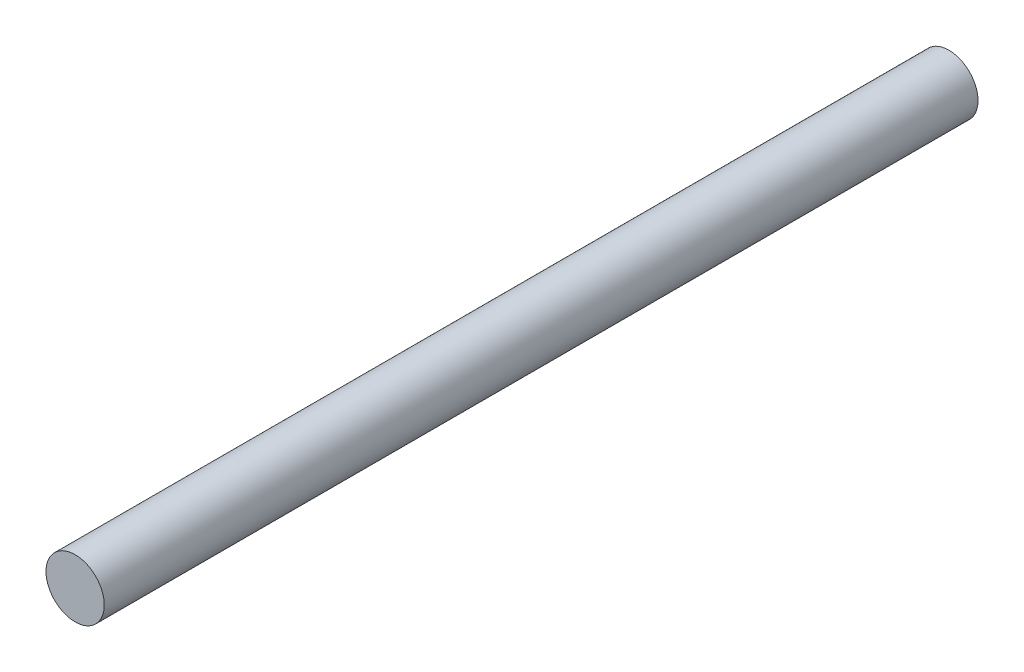
ISO-10303-21;
HEADER;
FILE_DESCRIPTION(('STEP AP214'),'2;1');
FILE_NAME('part.step','',(''),(''),'','','');
FILE_SCHEMA(('AUTOMOTIVE_DESIGN { 1 0 10303 214 1 1 1 1 }'));
ENDSEC;
DATA;
#1=APPLICATION_CONTEXT('core data for automotive mechanical design processes');
#2=APPLICATION_PROTOCOL_DEFINITION('international standard','automotive_design',2000,#1);
#3=PRODUCT_CONTEXT('',#1,'mechanical');
#4=PRODUCT('Part','Part','',(#3));
#5=PRODUCT_RELATED_PRODUCT_CATEGORY('part','',(#4));
#6=PRODUCT_DEFINITION_FORMATION('','',#4);
#7=PRODUCT_DEFINITION_CONTEXT('part definition',#1,'design');
#8=PRODUCT_DEFINITION('design','',#6,#7);
#9=PRODUCT_DEFINITION_SHAPE('','',#8);
#10=(LENGTH_UNIT() NAMED_UNIT(*) SI_UNIT(.MILLI.,.METRE.));
#11=(NAMED_UNIT(*) PLANE_ANGLE_UNIT() SI_UNIT($,.RADIAN.));
#12=(NAMED_UNIT(*) SI_UNIT($,.STERADIAN.) SOLID_ANGLE_UNIT());
#13=UNCERTAINTY_MEASURE_WITH_UNIT(LENGTH_MEASURE(1.E-05),#10,'distance_accuracy_value','');
#14=(GEOMETRIC_REPRESENTATION_CONTEXT(3) GLOBAL_UNCERTAINTY_ASSIGNED_CONTEXT((#13)) GLOBAL_UNIT_ASSIGNED_CONTEXT((#10,
#11,#12)) REPRESENTATION_CONTEXT('',''));
#15=CARTESIAN_POINT('',(0.,0.,0.));
#16=DIRECTION('',(0.,0.,1.));
#17=DIRECTION('',(1.,0.,0.));
#18=AXIS2_PLACEMENT_3D('',#15,#16,#17);
#19=CARTESIAN_POINT('',(0.,0.,180.));
#20=DIRECTION('',(0.,0.,-1.));
#21=DIRECTION('',(-1.,0.,0.));
#22=AXIS2_PLACEMENT_3D('',#19,#20,#21);
#23=CYLINDRICAL_SURFACE('',#22,6.);
#24=CARTESIAN_POINT('',(0.,0.,180.));
#25=DIRECTION('',(0.,0.,1.));
#26=DIRECTION('',(1.,0.,0.));
#27=AXIS2_PLACEMENT_3D('',#24,#25,#26);
#28=CIRCLE('',#27,6.);
#29=CARTESIAN_POINT('',(-6.,0.,180.));
#30=VERTEX_POINT('',#29);
#31=EDGE_CURVE('E10',#30,#30,#28,.T.);
#32=CARTESIAN_POINT('',(0.,0.,0.));
#33=DIRECTION('',(0.,0.,1.));
#34=DIRECTION('',(1.,0.,0.));
#35=AXIS2_PLACEMENT_3D('',#32,#33,#34);
#36=CIRCLE('',#35,6.);
#37=CARTESIAN_POINT('',(-6.,0.,0.));
#38=VERTEX_POINT('',#37);
#39=EDGE_CURVE('E34',#38,#38,#36,.T.);
#40=CARTESIAN_POINT('',(-6.,0.,180.));
#41=CARTESIAN_POINT('',(-6.,0.,178.125));
#42=CARTESIAN_POINT('',(-6.,0.,176.25));
#43=CARTESIAN_POINT('',(-6.,0.,172.5));
#44=CARTESIAN_POINT('',(-6.,0.,170.625));
#45=CARTESIAN_POINT('',(-6.,0.,166.875));
#46=CARTESIAN_POINT('',(-6.,0.,165.));
#47=CARTESIAN_POINT('',(-6.,0.,161.25));
#48=CARTESIAN_POINT('',(-6.,0.,159.375));
#49=CARTESIAN_POINT('',(-6.,0.,155.625));
#50=CARTESIAN_POINT('',(-6.,0.,153.75));
#51=CARTESIAN_POINT('',(-6.,0.,150.));
#52=CARTESIAN_POINT('',(-6.,0.,148.125));
#53=CARTESIAN_POINT('',(-6.,0.,144.375));
#54=CARTESIAN_POINT('',(-6.,0.,142.5));
#55=CARTESIAN_POINT('',(-6.,0.,138.75));
#56=CARTESIAN_POINT('',(-6.,0.,136.875));
#57=CARTESIAN_POINT('',(-6.,0.,133.125));
#58=CARTESIAN_POINT('',(-6.,0.,131.25));
#59=CARTESIAN_POINT('',(-6.,0.,127.5));
#60=CARTESIAN_POINT('',(-6.,0.,125.625));
#61=CARTESIAN_POINT('',(-6.,0.,121.875));
#62=CARTESIAN_POINT('',(-6.,0.,120.));
#63=CARTESIAN_POINT('',(-6.,0.,116.25));
#64=CARTESIAN_POINT('',(-6.,0.,114.375));
#65=CARTESIAN_POINT('',(-6.,0.,110.625));
#66=CARTESIAN_POINT('',(-6.,0.,108.75));
#67=CARTESIAN_POINT('',(-6.,0.,105.));
#68=CARTESIAN_POINT('',(-6.,0.,103.125));
#69=CARTESIAN_POINT('',(-6.,0.,99.375));
#70=CARTESIAN_POINT('',(-6.,0.,97.5));
#71=CARTESIAN_POINT('',(-6.,0.,93.75));
#72=CARTESIAN_POINT('',(-6.,0.,91.875));
#73=CARTESIAN_POINT('',(-6.,0.,88.125));
#74=CARTESIAN_POINT('',(-6.,0.,86.25));
#75=CARTESIAN_POINT('',(-6.,0.,82.5));
#76=CARTESIAN_POINT('',(-6.,0.,80.625));
#77=CARTESIAN_POINT('',(-6.,0.,76.875));
#78=CARTESIAN_POINT('',(-6.,0.,75.));
#79=CARTESIAN_POINT('',(-6.,0.,71.25));
#80=CARTESIAN_POINT('',(-6.,0.,69.375));
#81=CARTESIAN_POINT('',(-6.,0.,65.625));
#82=CARTESIAN_POINT('',(-6.,0.,63.75));
#83=CARTESIAN_POINT('',(-6.,0.,60.));
#84=CARTESIAN_POINT('',(-6.,0.,58.125));
#85=CARTESIAN_POINT('',(-6.,0.,54.375));
#86=CARTESIAN_POINT('',(-6.,0.,52.5));
#87=CARTESIAN_POINT('',(-6.,0.,48.75));
#88=CARTESIAN_POINT('',(-6.,0.,46.875));
#89=CARTESIAN_POINT('',(-6.,0.,43.125));
#90=CARTESIAN_POINT('',(-6.,0.,41.25));
#91=CARTESIAN_POINT('',(-6.,0.,37.5));
#92=CARTESIAN_POINT('',(-6.,0.,35.625));
#93=CARTESIAN_POINT('',(-6.,0.,31.875));
#94=CARTESIAN_POINT('',(-6.,0.,30.));
#95=CARTESIAN_POINT('',(-6.,0.,26.25));
#96=CARTESIAN_POINT('',(-6.,0.,24.375));
#97=CARTESIAN_POINT('',(-6.,0.,20.625));
#98=CARTESIAN_POINT('',(-6.,0.,18.75));
#99=CARTESIAN_POINT('',(-6.,0.,15.));
#100=CARTESIAN_POINT('',(-6.,0.,13.125));
#101=CARTESIAN_POINT('',(-6.,0.,9.37499999999998));
#102=CARTESIAN_POINT('',(-6.,0.,7.49999999999997));
#103=CARTESIAN_POINT('',(-6.,0.,3.74999999999997));
#104=CARTESIAN_POINT('',(-6.,0.,1.87499999999997));
#105=CARTESIAN_POINT('',(-6.,0.,0.));
#106=B_SPLINE_CURVE_WITH_KNOTS('',3,(#40,#41,#42,#43,#44,#45,#46,#47,#48,#49,#50,#51,#52,#53,
#54,#55,#56,#57,#58,#59,#60,#61,#62,#63,#64,#65,#66,#67,#68,#69,#70,#71,#72,#73,#74,#75,#76,#77,
#78,#79,#80,#81,#82,#83,#84,#85,#86,#87,#88,#89,#90,#91,#92,#93,#94,#95,#96,#97,#98,#99,#100,
#101,#102,#103,#104,#105),.UNSPECIFIED.,.F.,.F.,(4,2,2,2,2,2,2,2,2,2,2,2,2,2,2,2,2,2,2,2,2,2,2,
2,2,2,2,2,2,2,2,2,4),(0.,5.62499999999999,11.25,16.875,22.5,28.125,33.75,39.375,45.,50.625,
56.25,61.875,67.5,73.125,78.75,84.375,90.,95.625,101.25,106.875,112.5,118.125,123.75,129.375,
135.,140.625,146.25,151.875,157.5,163.125,168.75,174.375,180.),.UNSPECIFIED.);
#107=EDGE_CURVE('BSEAM31',#30,#38,#106,.T.);
#108=ORIENTED_EDGE('',*,*,#31,.F.);
#109=ORIENTED_EDGE('',*,*,#39,.T.);
#110=ORIENTED_EDGE('',*,*,#107,.T.);
#111=ORIENTED_EDGE('',*,*,#107,.F.);
#112=EDGE_LOOP('',(#108,#110,#109,#111));
#113=FACE_BOUND('',#112,.T.);
#114=ADVANCED_FACE('F31',(#113),#23,.T.);
#115=CARTESIAN_POINT('',(0.,0.,180.));
#116=DIRECTION('',(0.,0.,1.));
#117=DIRECTION('',(1.,0.,0.));
#118=AXIS2_PLACEMENT_3D('',#115,#116,#117);
#119=PLANE('',#118);
#120=ORIENTED_EDGE('',*,*,#31,.T.);
#121=EDGE_LOOP('',(#120));
#122=FACE_BOUND('',#121,.T.);
#123=ADVANCED_FACE('F46',(#122),#119,.T.);
#124=CARTESIAN_POINT('',(0.,0.,0.));
#125=DIRECTION('',(0.,0.,1.));
#126=DIRECTION('',(1.,0.,0.));
#127=AXIS2_PLACEMENT_3D('',#124,#125,#126);
#128=PLANE('',#127);
#129=ORIENTED_EDGE('',*,*,#39,.F.);
#130=EDGE_LOOP('',(#129));
#131=FACE_BOUND('',#130,.T.);
#132=ADVANCED_FACE('F44',(#131),#128,.F.);
#133=CLOSED_SHELL('',(#114,#123,#132));
#134=MANIFOLD_SOLID_BREP('B2',#133);
#135=ADVANCED_BREP_SHAPE_REPRESENTATION('',(#18,#134),#14);
#136=SHAPE_DEFINITION_REPRESENTATION(#9,#135);
ENDSEC;
END-ISO-10303-21;
